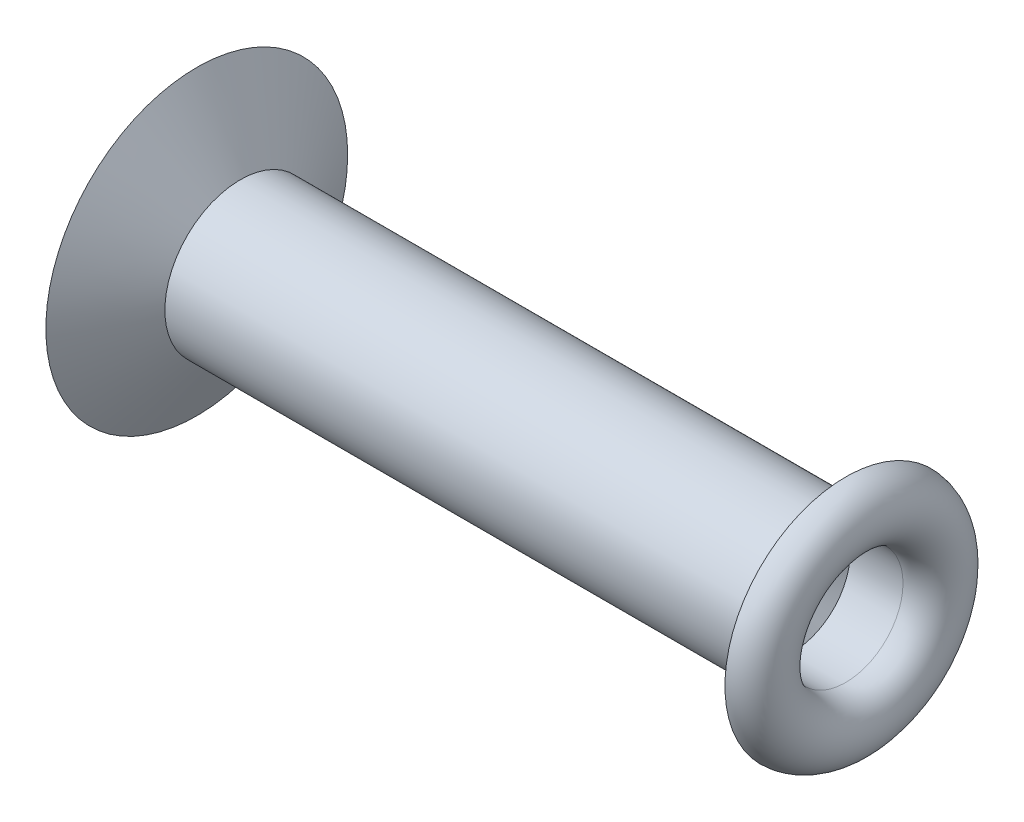
ISO-10303-21;
HEADER;
FILE_DESCRIPTION(('STEP AP214'),'2;1');
FILE_NAME('part.step','',(''),(''),'','','');
FILE_SCHEMA(('AUTOMOTIVE_DESIGN { 1 0 10303 214 1 1 1 1 }'));
ENDSEC;
DATA;
#1=APPLICATION_CONTEXT('core data for automotive mechanical design processes');
#2=APPLICATION_PROTOCOL_DEFINITION('international standard','automotive_design',2000,#1);
#3=PRODUCT_CONTEXT('',#1,'mechanical');
#4=PRODUCT('Part','Part','',(#3));
#5=PRODUCT_RELATED_PRODUCT_CATEGORY('part','',(#4));
#6=PRODUCT_DEFINITION_FORMATION('','',#4);
#7=PRODUCT_DEFINITION_CONTEXT('part definition',#1,'design');
#8=PRODUCT_DEFINITION('design','',#6,#7);
#9=PRODUCT_DEFINITION_SHAPE('','',#8);
#10=(LENGTH_UNIT() NAMED_UNIT(*) SI_UNIT(.MILLI.,.METRE.));
#11=(NAMED_UNIT(*) PLANE_ANGLE_UNIT() SI_UNIT($,.RADIAN.));
#12=(NAMED_UNIT(*) SI_UNIT($,.STERADIAN.) SOLID_ANGLE_UNIT());
#13=UNCERTAINTY_MEASURE_WITH_UNIT(LENGTH_MEASURE(1.E-05),#10,'distance_accuracy_value','');
#14=(GEOMETRIC_REPRESENTATION_CONTEXT(3) GLOBAL_UNCERTAINTY_ASSIGNED_CONTEXT((#13)) GLOBAL_UNIT_ASSIGNED_CONTEXT((#10,
#11,#12)) REPRESENTATION_CONTEXT('',''));
#15=CARTESIAN_POINT('',(0.,0.,0.));
#16=DIRECTION('',(0.,0.,1.));
#17=DIRECTION('',(1.,0.,0.));
#18=AXIS2_PLACEMENT_3D('',#15,#16,#17);
#19=CARTESIAN_POINT('',(-40.1132486540519,0.,0.));
#20=DIRECTION('',(-1.,0.,0.));
#21=DIRECTION('',(0.,0.,1.));
#22=AXIS2_PLACEMENT_3D('',#19,#20,#21);
#23=CONICAL_SURFACE('',#22,4.99999999999999,1.0471975511966);
#24=CARTESIAN_POINT('',(-43.,0.,0.));
#25=DIRECTION('',(1.,0.,0.));
#26=DIRECTION('',(0.,0.,-1.));
#27=AXIS2_PLACEMENT_3D('',#24,#25,#26);
#28=CIRCLE('',#27,9.99999999999999);
#29=CARTESIAN_POINT('',(-43.,0.,-9.99999999999999));
#30=VERTEX_POINT('',#29);
#31=EDGE_CURVE('E11',#30,#30,#28,.T.);
#32=ORIENTED_EDGE('',*,*,#31,.T.);
#33=EDGE_LOOP('',(#32));
#34=FACE_BOUND('',#33,.T.);
#35=CARTESIAN_POINT('',(-40.1132486540519,0.,0.));
#36=DIRECTION('',(1.,0.,0.));
#37=DIRECTION('',(0.,0.,-1.));
#38=AXIS2_PLACEMENT_3D('',#35,#36,#37);
#39=CIRCLE('',#38,4.99999999999999);
#40=CARTESIAN_POINT('',(-40.1132486540519,0.,-4.99999999999999));
#41=VERTEX_POINT('',#40);
#42=EDGE_CURVE('E64',#41,#41,#39,.T.);
#43=ORIENTED_EDGE('',*,*,#42,.F.);
#44=EDGE_LOOP('',(#43));
#45=FACE_BOUND('',#44,.T.);
#46=ADVANCED_FACE('F32',(#34,#45),#23,.T.);
#47=CARTESIAN_POINT('',(-43.,0.,0.));
#48=DIRECTION('',(-1.,0.,0.));
#49=DIRECTION('',(0.,0.,1.));
#50=AXIS2_PLACEMENT_3D('',#47,#48,#49);
#51=PLANE('',#50);
#52=ORIENTED_EDGE('',*,*,#31,.F.);
#53=EDGE_LOOP('',(#52));
#54=FACE_BOUND('',#53,.T.);
#55=ADVANCED_FACE('F44',(#54),#51,.T.);
#56=CARTESIAN_POINT('',(-5.78327035230471,0.,0.));
#57=DIRECTION('',(1.,0.,0.));
#58=DIRECTION('',(0.,0.,-1.));
#59=AXIS2_PLACEMENT_3D('',#56,#57,#58);
#60=CONICAL_SURFACE('',#59,0.,1.02974425867666);
#61=CARTESIAN_POINT('',(-3.5,0.,0.));
#62=DIRECTION('',(1.,0.,0.));
#63=DIRECTION('',(0.,0.,-1.));
#64=AXIS2_PLACEMENT_3D('',#61,#62,#63);
#65=CIRCLE('',#64,3.79999999999999);
#66=CARTESIAN_POINT('',(-3.5,0.,-3.79999999999999));
#67=VERTEX_POINT('',#66);
#68=EDGE_CURVE('E38',#67,#67,#65,.T.);
#69=ORIENTED_EDGE('',*,*,#68,.T.);
#70=EDGE_LOOP('',(#69));
#71=FACE_BOUND('',#70,.T.);
#72=CARTESIAN_POINT('',(-5.78327035230471,0.,0.));
#73=VERTEX_POINT('',#72);
#74=VERTEX_LOOP('',#73);
#75=FACE_BOUND('',#74,.T.);
#76=ADVANCED_FACE('F41',(#71,#75),#60,.F.);
#77=CARTESIAN_POINT('',(40.3769281037232,0.,0.));
#78=DIRECTION('',(1.,0.,0.));
#79=DIRECTION('',(0.,0.,-1.));
#80=AXIS2_PLACEMENT_3D('',#77,#78,#79);
#81=CYLINDRICAL_SURFACE('',#80,3.8);
#82=CARTESIAN_POINT('',(0.,0.,0.));
#83=DIRECTION('',(1.,0.,0.));
#84=DIRECTION('',(0.,0.,-1.));
#85=AXIS2_PLACEMENT_3D('',#82,#83,#84);
#86=CIRCLE('',#85,3.8);
#87=CARTESIAN_POINT('',(0.,0.,-3.8));
#88=VERTEX_POINT('',#87);
#89=EDGE_CURVE('E77',#88,#88,#86,.T.);
#90=ORIENTED_EDGE('',*,*,#89,.T.);
#91=EDGE_LOOP('',(#90));
#92=FACE_BOUND('',#91,.T.);
#93=ORIENTED_EDGE('',*,*,#68,.F.);
#94=EDGE_LOOP('',(#93));
#95=FACE_BOUND('',#94,.T.);
#96=ADVANCED_FACE('F43',(#92,#95),#81,.F.);
#97=CARTESIAN_POINT('',(-0.102499999999998,0.,0.));
#98=DIRECTION('',(1.,0.,0.));
#99=DIRECTION('',(0.,0.,-1.));
#100=AXIS2_PLACEMENT_3D('',#97,#98,#99);
#101=TOROIDAL_SURFACE('',#100,5.9,2.1025);
#102=CARTESIAN_POINT('',(0.,0.,0.));
#103=DIRECTION('',(1.,0.,0.));
#104=DIRECTION('',(0.,0.,-1.));
#105=AXIS2_PLACEMENT_3D('',#102,#103,#104);
#106=CIRCLE('',#105,8.);
#107=CARTESIAN_POINT('',(0.,0.,-8.));
#108=VERTEX_POINT('',#107);
#109=EDGE_CURVE('E74',#108,#108,#106,.T.);
#110=ORIENTED_EDGE('',*,*,#109,.T.);
#111=EDGE_LOOP('',(#110));
#112=FACE_BOUND('',#111,.T.);
#113=ORIENTED_EDGE('',*,*,#89,.F.);
#114=EDGE_LOOP('',(#113));
#115=FACE_BOUND('',#114,.T.);
#116=ADVANCED_FACE('F51',(#112,#115),#101,.T.);
#117=CARTESIAN_POINT('',(0.,8.,0.));
#118=DIRECTION('',(-1.,0.,0.));
#119=DIRECTION('',(0.,0.,1.));
#120=AXIS2_PLACEMENT_3D('',#117,#118,#119);
#121=PLANE('',#120);
#122=CARTESIAN_POINT('',(0.,0.,0.));
#123=DIRECTION('',(1.,0.,0.));
#124=DIRECTION('',(0.,0.,-1.));
#125=AXIS2_PLACEMENT_3D('',#122,#123,#124);
#126=CIRCLE('',#125,6.79414414386049);
#127=CARTESIAN_POINT('',(0.,0.,-6.79414414386049));
#128=VERTEX_POINT('',#127);
#129=EDGE_CURVE('E69',#128,#128,#126,.T.);
#130=ORIENTED_EDGE('',*,*,#129,.T.);
#131=EDGE_LOOP('',(#130));
#132=FACE_BOUND('',#131,.T.);
#133=ORIENTED_EDGE('',*,*,#109,.F.);
#134=EDGE_LOOP('',(#133));
#135=FACE_BOUND('',#134,.T.);
#136=ADVANCED_FACE('F84',(#132,#135),#121,.T.);
#137=CARTESIAN_POINT('',(-0.102499999999998,0.,0.));
#138=DIRECTION('',(1.,0.,0.));
#139=DIRECTION('',(0.,0.,-1.));
#140=AXIS2_PLACEMENT_3D('',#137,#138,#139);
#141=TOROIDAL_SURFACE('',#140,5.9,0.900000000000006);
#142=CARTESIAN_POINT('',(-0.102499999999998,0.,0.));
#143=DIRECTION('',(1.,0.,0.));
#144=DIRECTION('',(0.,0.,-1.));
#145=AXIS2_PLACEMENT_3D('',#142,#143,#144);
#146=CIRCLE('',#145,4.99999999999999);
#147=CARTESIAN_POINT('',(-0.102499999999998,0.,-4.99999999999999));
#148=VERTEX_POINT('',#147);
#149=EDGE_CURVE('E66',#148,#148,#146,.T.);
#150=ORIENTED_EDGE('',*,*,#149,.T.);
#151=EDGE_LOOP('',(#150));
#152=FACE_BOUND('',#151,.T.);
#153=ORIENTED_EDGE('',*,*,#129,.F.);
#154=EDGE_LOOP('',(#153));
#155=FACE_BOUND('',#154,.T.);
#156=ADVANCED_FACE('F90',(#152,#155),#141,.F.);
#157=CARTESIAN_POINT('',(40.3769281037232,0.,0.));
#158=DIRECTION('',(1.,0.,0.));
#159=DIRECTION('',(0.,0.,-1.));
#160=AXIS2_PLACEMENT_3D('',#157,#158,#159);
#161=CYLINDRICAL_SURFACE('',#160,4.99999999999999);
#162=ORIENTED_EDGE('',*,*,#42,.T.);
#163=EDGE_LOOP('',(#162));
#164=FACE_BOUND('',#163,.T.);
#165=ORIENTED_EDGE('',*,*,#149,.F.);
#166=EDGE_LOOP('',(#165));
#167=FACE_BOUND('',#166,.T.);
#168=ADVANCED_FACE('F96',(#164,#167),#161,.T.);
#169=CLOSED_SHELL('',(#46,#55,#76,#96,#116,#136,#156,#168));
#170=MANIFOLD_SOLID_BREP('B2',#169);
#171=ADVANCED_BREP_SHAPE_REPRESENTATION('',(#18,#170),#14);
#172=SHAPE_DEFINITION_REPRESENTATION(#9,#171);
ENDSEC;
END-ISO-10303-21;
